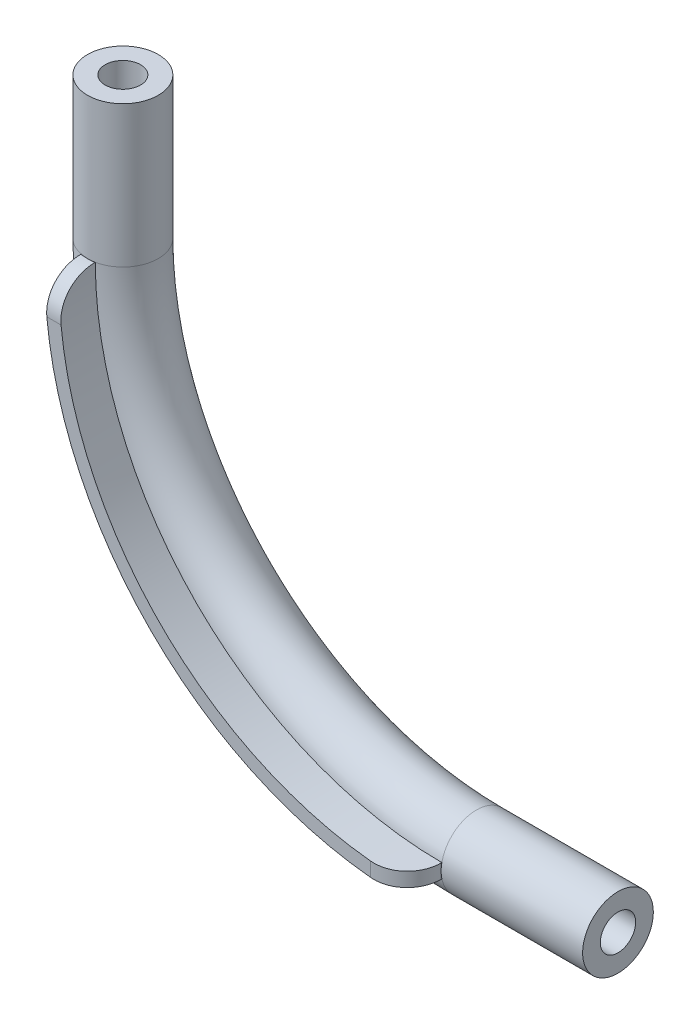
ISO-10303-21;
HEADER;
FILE_DESCRIPTION(('STEP AP214'),'2;1');
FILE_NAME('part.step','',(''),(''),'','','');
FILE_SCHEMA(('AUTOMOTIVE_DESIGN { 1 0 10303 214 1 1 1 1 }'));
ENDSEC;
DATA;
#1=APPLICATION_CONTEXT('core data for automotive mechanical design processes');
#2=APPLICATION_PROTOCOL_DEFINITION('international standard','automotive_design',2000,#1);
#3=PRODUCT_CONTEXT('',#1,'mechanical');
#4=PRODUCT('Part','Part','',(#3));
#5=PRODUCT_RELATED_PRODUCT_CATEGORY('part','',(#4));
#6=PRODUCT_DEFINITION_FORMATION('','',#4);
#7=PRODUCT_DEFINITION_CONTEXT('part definition',#1,'design');
#8=PRODUCT_DEFINITION('design','',#6,#7);
#9=PRODUCT_DEFINITION_SHAPE('','',#8);
#10=(LENGTH_UNIT() NAMED_UNIT(*) SI_UNIT(.MILLI.,.METRE.));
#11=(NAMED_UNIT(*) PLANE_ANGLE_UNIT() SI_UNIT($,.RADIAN.));
#12=(NAMED_UNIT(*) SI_UNIT($,.STERADIAN.) SOLID_ANGLE_UNIT());
#13=UNCERTAINTY_MEASURE_WITH_UNIT(LENGTH_MEASURE(1.E-05),#10,'distance_accuracy_value','');
#14=(GEOMETRIC_REPRESENTATION_CONTEXT(3) GLOBAL_UNCERTAINTY_ASSIGNED_CONTEXT((#13)) GLOBAL_UNIT_ASSIGNED_CONTEXT((#10,
#11,#12)) REPRESENTATION_CONTEXT('',''));
#15=CARTESIAN_POINT('',(0.,0.,0.));
#16=DIRECTION('',(0.,0.,1.));
#17=DIRECTION('',(1.,0.,0.));
#18=AXIS2_PLACEMENT_3D('',#15,#16,#17);
#19=CARTESIAN_POINT('',(-48.9999999999999,0.,10.));
#20=DIRECTION('',(0.,-1.,0.));
#21=DIRECTION('',(0.,0.,-1.));
#22=AXIS2_PLACEMENT_3D('',#19,#20,#21);
#23=PLANE('',#22);
#24=DIRECTION('',(0.,0.,-1.));
#25=VECTOR('',#24,1.);
#26=CARTESIAN_POINT('',(-50.9999999999999,0.,10.));
#27=LINE('',#26,#25);
#28=CARTESIAN_POINT('',(-50.9999999999999,0.,5.));
#29=VERTEX_POINT('',#28);
#30=CARTESIAN_POINT('',(-50.9999999999999,0.,4.89897948556637));
#31=VERTEX_POINT('',#30);
#32=EDGE_CURVE('E103',#29,#31,#27,.T.);
#33=ORIENTED_EDGE('',*,*,#32,.F.);
#34=DIRECTION('',(-1.,0.,0.));
#35=VECTOR('',#34,1.);
#36=CARTESIAN_POINT('',(-48.9999999999999,0.,5.));
#37=LINE('',#36,#35);
#38=CARTESIAN_POINT('',(-50.,0.,5.));
#39=VERTEX_POINT('',#38);
#40=EDGE_CURVE('E12',#29,#39,#37,.F.);
#41=ORIENTED_EDGE('',*,*,#40,.T.);
#42=CARTESIAN_POINT('',(-50.,0.,0.));
#43=DIRECTION('',(0.,1.,0.));
#44=DIRECTION('',(0.,0.,1.));
#45=AXIS2_PLACEMENT_3D('',#42,#43,#44);
#46=CIRCLE('',#45,5.);
#47=EDGE_CURVE('E114',#31,#39,#46,.T.);
#48=ORIENTED_EDGE('',*,*,#47,.F.);
#49=EDGE_LOOP('',(#33,#41,#48));
#50=FACE_BOUND('',#49,.T.);
#51=ADVANCED_FACE('F45',(#50),#23,.F.);
#52=CARTESIAN_POINT('',(0.,-48.9999999999999,10.));
#53=DIRECTION('',(-1.,0.,0.));
#54=DIRECTION('',(0.,0.,1.));
#55=AXIS2_PLACEMENT_3D('',#52,#53,#54);
#56=PLANE('',#55);
#57=DIRECTION('',(0.,0.,-1.));
#58=VECTOR('',#57,1.);
#59=CARTESIAN_POINT('',(0.,-48.9999999999999,10.));
#60=LINE('',#59,#58);
#61=CARTESIAN_POINT('',(0.,-48.9999999999999,5.));
#62=VERTEX_POINT('',#61);
#63=CARTESIAN_POINT('',(0.,-48.9999999999999,4.89897948556634));
#64=VERTEX_POINT('',#63);
#65=EDGE_CURVE('E168',#62,#64,#60,.T.);
#66=ORIENTED_EDGE('',*,*,#65,.F.);
#67=DIRECTION('',(0.,1.,0.));
#68=VECTOR('',#67,1.);
#69=CARTESIAN_POINT('',(0.,-50.9999999999999,5.));
#70=LINE('',#69,#68);
#71=CARTESIAN_POINT('',(1.74574066942157E-13,-50.,5.));
#72=VERTEX_POINT('',#71);
#73=EDGE_CURVE('E305',#62,#72,#70,.F.);
#74=ORIENTED_EDGE('',*,*,#73,.T.);
#75=CARTESIAN_POINT('',(1.74574066942157E-13,-50.,0.));
#76=DIRECTION('',(-1.,0.,0.));
#77=DIRECTION('',(0.,0.,1.));
#78=AXIS2_PLACEMENT_3D('',#75,#76,#77);
#79=CIRCLE('',#78,5.);
#80=EDGE_CURVE('E136',#72,#64,#79,.T.);
#81=ORIENTED_EDGE('',*,*,#80,.T.);
#82=EDGE_LOOP('',(#66,#74,#81));
#83=FACE_BOUND('',#82,.T.);
#84=ADVANCED_FACE('F251',(#83),#56,.F.);
#85=CARTESIAN_POINT('',(0.,0.,0.));
#86=DIRECTION('',(0.,0.,-1.));
#87=DIRECTION('',(-1.,0.,0.));
#88=AXIS2_PLACEMENT_3D('',#85,#86,#87);
#89=TOROIDAL_SURFACE('',#88,50.,5.);
#90=CARTESIAN_POINT('',(-48.9999999999999,0.,4.89897948556634));
#91=VERTEX_POINT('',#90);
#92=EDGE_CURVE('E119',#91,#31,#46,.T.);
#93=ORIENTED_EDGE('',*,*,#92,.F.);
#94=CARTESIAN_POINT('',(0.,0.,4.89897948556634));
#95=DIRECTION('',(0.,0.,-1.));
#96=DIRECTION('',(-1.,0.,0.));
#97=AXIS2_PLACEMENT_3D('',#94,#95,#96);
#98=CIRCLE('',#97,48.9999999999999);
#99=EDGE_CURVE('E130',#91,#64,#98,.F.);
#100=ORIENTED_EDGE('',*,*,#99,.T.);
#101=CARTESIAN_POINT('',(0.,-50.9999999999999,4.89897948556637));
#102=VERTEX_POINT('',#101);
#103=EDGE_CURVE('E128',#64,#102,#79,.T.);
#104=ORIENTED_EDGE('',*,*,#103,.T.);
#105=CARTESIAN_POINT('',(0.,0.,4.89897948556637));
#106=DIRECTION('',(0.,0.,-1.));
#107=DIRECTION('',(-1.,0.,0.));
#108=AXIS2_PLACEMENT_3D('',#105,#106,#107);
#109=CIRCLE('',#108,50.9999999999999);
#110=EDGE_CURVE('E107',#102,#31,#109,.T.);
#111=ORIENTED_EDGE('',*,*,#110,.T.);
#112=EDGE_LOOP('',(#93,#100,#104,#111));
#113=FACE_BOUND('',#112,.T.);
#114=ADVANCED_FACE('F125',(#113),#89,.T.);
#115=CARTESIAN_POINT('',(20.0000000000002,-49.9999999999999,0.));
#116=DIRECTION('',(1.,0.,0.));
#117=DIRECTION('',(0.,1.,0.));
#118=AXIS2_PLACEMENT_3D('',#115,#116,#117);
#119=PLANE('',#118);
#120=CARTESIAN_POINT('',(20.0000000000002,-49.9999999999999,0.));
#121=DIRECTION('',(1.,0.,0.));
#122=DIRECTION('',(0.,1.,0.));
#123=AXIS2_PLACEMENT_3D('',#120,#121,#122);
#124=CIRCLE('',#123,5.);
#125=CARTESIAN_POINT('',(20.0000000000002,-44.9999999999999,0.));
#126=VERTEX_POINT('',#125);
#127=EDGE_CURVE('E142',#126,#126,#124,.T.);
#128=ORIENTED_EDGE('',*,*,#127,.T.);
#129=EDGE_LOOP('',(#128));
#130=FACE_BOUND('',#129,.T.);
#131=CARTESIAN_POINT('',(20.0000000000002,-49.9999999999999,0.));
#132=DIRECTION('',(1.,0.,0.));
#133=DIRECTION('',(0.,1.,0.));
#134=AXIS2_PLACEMENT_3D('',#131,#132,#133);
#135=CIRCLE('',#134,2.5);
#136=CARTESIAN_POINT('',(20.0000000000002,-47.4999999999999,0.));
#137=VERTEX_POINT('',#136);
#138=EDGE_CURVE('E145',#137,#137,#135,.T.);
#139=ORIENTED_EDGE('',*,*,#138,.F.);
#140=EDGE_LOOP('',(#139));
#141=FACE_BOUND('',#140,.T.);
#142=ADVANCED_FACE('F238',(#130,#141),#119,.T.);
#143=CARTESIAN_POINT('',(20.0000000000002,-49.9999999999999,0.));
#144=DIRECTION('',(-1.,0.,0.));
#145=DIRECTION('',(0.,-1.,0.));
#146=AXIS2_PLACEMENT_3D('',#143,#144,#145);
#147=CYLINDRICAL_SURFACE('',#146,5.);
#148=ORIENTED_EDGE('',*,*,#127,.F.);
#149=EDGE_LOOP('',(#148));
#150=FACE_BOUND('',#149,.T.);
#151=ORIENTED_EDGE('',*,*,#103,.F.);
#152=ORIENTED_EDGE('',*,*,#80,.F.);
#153=EDGE_CURVE('E138',#102,#72,#79,.T.);
#154=ORIENTED_EDGE('',*,*,#153,.F.);
#155=EDGE_LOOP('',(#151,#152,#154));
#156=FACE_BOUND('',#155,.T.);
#157=ADVANCED_FACE('F236',(#150,#156),#147,.T.);
#158=CARTESIAN_POINT('',(20.0000000000002,-49.9999999999999,0.));
#159=DIRECTION('',(-1.,0.,0.));
#160=DIRECTION('',(0.,-1.,0.));
#161=AXIS2_PLACEMENT_3D('',#158,#159,#160);
#162=CYLINDRICAL_SURFACE('',#161,2.5);
#163=ORIENTED_EDGE('',*,*,#138,.T.);
#164=EDGE_LOOP('',(#163));
#165=FACE_BOUND('',#164,.T.);
#166=CARTESIAN_POINT('',(1.74574066942157E-13,-50.,0.));
#167=DIRECTION('',(1.,0.,0.));
#168=DIRECTION('',(0.,1.,0.));
#169=AXIS2_PLACEMENT_3D('',#166,#167,#168);
#170=CIRCLE('',#169,2.5);
#171=CARTESIAN_POINT('',(1.65845363595049E-13,-47.5,0.));
#172=VERTEX_POINT('',#171);
#173=EDGE_CURVE('E150',#172,#172,#170,.T.);
#174=ORIENTED_EDGE('',*,*,#173,.F.);
#175=EDGE_LOOP('',(#174));
#176=FACE_BOUND('',#175,.T.);
#177=ADVANCED_FACE('F233',(#165,#176),#162,.F.);
#178=CARTESIAN_POINT('',(1.74574066942157E-13,-50.,0.));
#179=DIRECTION('',(-1.,0.,0.));
#180=DIRECTION('',(0.,0.,1.));
#181=AXIS2_PLACEMENT_3D('',#178,#179,#180);
#182=PLANE('',#181);
#183=ORIENTED_EDGE('',*,*,#173,.T.);
#184=EDGE_LOOP('',(#183));
#185=FACE_BOUND('',#184,.T.);
#186=ADVANCED_FACE('F228',(#185),#182,.F.);
#187=CARTESIAN_POINT('',(-50.,20.,0.));
#188=DIRECTION('',(0.,1.,0.));
#189=DIRECTION('',(0.,0.,1.));
#190=AXIS2_PLACEMENT_3D('',#187,#188,#189);
#191=PLANE('',#190);
#192=CARTESIAN_POINT('',(-50.,20.,0.));
#193=DIRECTION('',(0.,1.,0.));
#194=DIRECTION('',(0.,0.,1.));
#195=AXIS2_PLACEMENT_3D('',#192,#193,#194);
#196=CIRCLE('',#195,5.);
#197=CARTESIAN_POINT('',(-50.,20.,5.));
#198=VERTEX_POINT('',#197);
#199=EDGE_CURVE('E155',#198,#198,#196,.T.);
#200=ORIENTED_EDGE('',*,*,#199,.T.);
#201=EDGE_LOOP('',(#200));
#202=FACE_BOUND('',#201,.T.);
#203=CARTESIAN_POINT('',(-50.,20.,0.));
#204=DIRECTION('',(0.,1.,0.));
#205=DIRECTION('',(0.,0.,1.));
#206=AXIS2_PLACEMENT_3D('',#203,#204,#205);
#207=CIRCLE('',#206,2.5);
#208=CARTESIAN_POINT('',(-50.,20.,2.5));
#209=VERTEX_POINT('',#208);
#210=EDGE_CURVE('E160',#209,#209,#207,.T.);
#211=ORIENTED_EDGE('',*,*,#210,.F.);
#212=EDGE_LOOP('',(#211));
#213=FACE_BOUND('',#212,.T.);
#214=ADVANCED_FACE('F225',(#202,#213),#191,.T.);
#215=CARTESIAN_POINT('',(-50.,20.,0.));
#216=DIRECTION('',(0.,-1.,0.));
#217=DIRECTION('',(0.,0.,-1.));
#218=AXIS2_PLACEMENT_3D('',#215,#216,#217);
#219=CYLINDRICAL_SURFACE('',#218,5.);
#220=ORIENTED_EDGE('',*,*,#199,.F.);
#221=EDGE_LOOP('',(#220));
#222=FACE_BOUND('',#221,.T.);
#223=ORIENTED_EDGE('',*,*,#92,.T.);
#224=ORIENTED_EDGE('',*,*,#47,.T.);
#225=EDGE_CURVE('E120',#39,#91,#46,.T.);
#226=ORIENTED_EDGE('',*,*,#225,.T.);
#227=EDGE_LOOP('',(#223,#224,#226));
#228=FACE_BOUND('',#227,.T.);
#229=ADVANCED_FACE('F133',(#222,#228),#219,.T.);
#230=CARTESIAN_POINT('',(-50.,20.,0.));
#231=DIRECTION('',(0.,-1.,0.));
#232=DIRECTION('',(0.,0.,-1.));
#233=AXIS2_PLACEMENT_3D('',#230,#231,#232);
#234=CYLINDRICAL_SURFACE('',#233,2.5);
#235=ORIENTED_EDGE('',*,*,#210,.T.);
#236=EDGE_LOOP('',(#235));
#237=FACE_BOUND('',#236,.T.);
#238=CARTESIAN_POINT('',(-50.,0.,0.));
#239=DIRECTION('',(0.,1.,0.));
#240=DIRECTION('',(0.,0.,1.));
#241=AXIS2_PLACEMENT_3D('',#238,#239,#240);
#242=CIRCLE('',#241,2.5);
#243=CARTESIAN_POINT('',(-50.,0.,2.5));
#244=VERTEX_POINT('',#243);
#245=EDGE_CURVE('E131',#244,#244,#242,.F.);
#246=ORIENTED_EDGE('',*,*,#245,.T.);
#247=EDGE_LOOP('',(#246));
#248=FACE_BOUND('',#247,.T.);
#249=ADVANCED_FACE('F220',(#237,#248),#234,.F.);
#250=CARTESIAN_POINT('',(-50.,0.,0.));
#251=DIRECTION('',(0.,1.,0.));
#252=DIRECTION('',(0.,0.,1.));
#253=AXIS2_PLACEMENT_3D('',#250,#251,#252);
#254=PLANE('',#253);
#255=ORIENTED_EDGE('',*,*,#245,.F.);
#256=EDGE_LOOP('',(#255));
#257=FACE_BOUND('',#256,.T.);
#258=ADVANCED_FACE('F218',(#257),#254,.T.);
#259=CARTESIAN_POINT('',(0.,0.,10.));
#260=DIRECTION('',(0.,0.,-1.));
#261=DIRECTION('',(-1.,0.,0.));
#262=AXIS2_PLACEMENT_3D('',#259,#260,#261);
#263=CYLINDRICAL_SURFACE('',#262,48.9999999999999);
#264=CARTESIAN_POINT('',(0.,0.,10.));
#265=DIRECTION('',(0.,0.,-1.));
#266=DIRECTION('',(1.,0.,0.));
#267=AXIS2_PLACEMENT_3D('',#264,#265,#266);
#268=CIRCLE('',#267,48.9999999999999);
#269=CARTESIAN_POINT('',(-5.,-48.7442304278157,10.));
#270=VERTEX_POINT('',#269);
#271=CARTESIAN_POINT('',(-48.7442304278157,-5.,10.));
#272=VERTEX_POINT('',#271);
#273=EDGE_CURVE('E176',#270,#272,#268,.T.);
#274=ORIENTED_EDGE('',*,*,#273,.F.);
#275=CARTESIAN_POINT('',(-5.,-48.7442304278157,10.));
#276=CARTESIAN_POINT('',(-4.86017441797673,-48.7585792797511,10.0000153004217));
#277=CARTESIAN_POINT('',(-4.7202855809839,-48.7723147059681,9.99413521876398));
#278=CARTESIAN_POINT('',(-4.44137503190063,-48.7985004736699,9.97066217371852));
#279=CARTESIAN_POINT('',(-4.30235330762638,-48.8109508332494,9.95306937528225));
#280=CARTESIAN_POINT('',(-4.02626060146251,-48.8345006258867,9.90626470659038));
#281=CARTESIAN_POINT('',(-3.8891883564166,-48.8456009725255,9.87706075161901));
#282=CARTESIAN_POINT('',(-3.61788542500017,-48.8664445655823,9.80722130069914));
#283=CARTESIAN_POINT('',(-3.48365467328208,-48.8761878432384,9.76658606795056));
#284=CARTESIAN_POINT('',(-3.2189370920303,-48.8943356474136,9.67412889114649));
#285=CARTESIAN_POINT('',(-3.08845207550527,-48.9027395343098,9.6223016300176));
#286=CARTESIAN_POINT('',(-2.83219052461939,-48.9182499884162,9.50780478812476));
#287=CARTESIAN_POINT('',(-2.70641575196349,-48.9253560740058,9.44513119896824));
#288=CARTESIAN_POINT('',(-2.46061218599521,-48.9383339355701,9.3094322427144));
#289=CARTESIAN_POINT('',(-2.34057999933082,-48.9442064476103,9.23641309255532));
#290=CARTESIAN_POINT('',(-2.10700734464295,-48.9548178928924,9.08048017956363));
#291=CARTESIAN_POINT('',(-1.99346928425211,-48.9595564077627,8.99756278177549));
#292=CARTESIAN_POINT('',(-1.77409549093508,-48.9679956690767,8.82271543306467));
#293=CARTESIAN_POINT('',(-1.66823694192971,-48.9716995913831,8.73081425868718));
#294=CARTESIAN_POINT('',(-1.46455588320102,-48.9782141866266,8.53839929025428));
#295=CARTESIAN_POINT('',(-1.36673637358137,-48.9810245271987,8.43788230918329));
#296=CARTESIAN_POINT('',(-1.17989079118149,-48.9858815691733,8.2289935243221));
#297=CARTESIAN_POINT('',(-1.09086340561423,-48.9879283847078,8.12062289739341));
#298=CARTESIAN_POINT('',(-0.922189672051435,-48.991394011965,7.89674187985369));
#299=CARTESIAN_POINT('',(-0.842546681176386,-48.9928125994464,7.78122895659379));
#300=CARTESIAN_POINT('',(-0.693156182563999,-48.9951540940655,7.54377564579952));
#301=CARTESIAN_POINT('',(-0.623420528165078,-48.9960764110701,7.4218277945569));
#302=CARTESIAN_POINT('',(-0.494452808233343,-48.9975476631925,7.17249761095789));
#303=CARTESIAN_POINT('',(-0.435220804632002,-48.9980965961088,7.04511524656409));
#304=CARTESIAN_POINT('',(-0.327705674289029,-48.9989336812648,6.78587323878777));
#305=CARTESIAN_POINT('',(-0.279417512301815,-48.9992219536172,6.65401568667158));
#306=CARTESIAN_POINT('',(-0.194108484119477,-48.9996340250887,6.38675609929582));
#307=CARTESIAN_POINT('',(-0.157085261454811,-48.9997578586243,6.25135481178156));
#308=CARTESIAN_POINT('',(-0.0840325125515623,-48.9999461926989,5.93185869757287));
#309=CARTESIAN_POINT('',(-0.0525228803330134,-48.9999767426749,5.74669930777758));
#310=CARTESIAN_POINT('',(-0.021013636381859,-48.9999964252199,5.46741856342599));
#311=CARTESIAN_POINT('',(-0.0131364293502629,-48.9999986341404,5.37411267438593));
#312=CARTESIAN_POINT('',(-0.00263029648664553,-49.000000097563,5.18721247932757));
#313=CARTESIAN_POINT('',(-9.9877976467384E-07,-48.9999993522744,5.09361819421621));
#314=CARTESIAN_POINT('',(0.,-48.9999999999999,5.));
#315=B_SPLINE_CURVE_WITH_KNOTS('',3,(#275,#276,#277,#278,#279,#280,#281,#282,#283,#284,#285,
#286,#287,#288,#289,#290,#291,#292,#293,#294,#295,#296,#297,#298,#299,#300,#301,#302,#303,#304,
#305,#306,#307,#308,#309,#310,#311,#312,#313,#314),.UNSPECIFIED.,.F.,.F.,(4,2,2,2,2,2,2,2,2,2,2,
2,2,2,2,2,2,2,2,4),(0.,0.421555963410781,0.843105990128122,1.26436913905422,1.68562258938376,
2.10707660947677,2.52868671694139,2.95004453324109,3.37155756449861,3.79176210045412,
4.21212274784636,4.63242053431788,5.05286822218543,5.47381478072738,5.89476382116584,
6.31551878858702,6.73618567927903,7.29829803666771,7.57908788996456,7.8598578453576),.UNSPECIFIED.);
#316=EDGE_CURVE('E206',#270,#62,#315,.T.);
#317=ORIENTED_EDGE('',*,*,#316,.T.);
#318=ORIENTED_EDGE('',*,*,#65,.T.);
#319=ORIENTED_EDGE('',*,*,#99,.F.);
#320=DIRECTION('',(0.,0.,-1.));
#321=VECTOR('',#320,1.);
#322=CARTESIAN_POINT('',(-48.9999999999999,0.,10.));
#323=LINE('',#322,#321);
#324=CARTESIAN_POINT('',(-48.9999999999999,0.,5.));
#325=VERTEX_POINT('',#324);
#326=EDGE_CURVE('E110',#325,#91,#323,.T.);
#327=ORIENTED_EDGE('',*,*,#326,.F.);
#328=CARTESIAN_POINT('',(-48.9999999999999,0.,5.));
#329=CARTESIAN_POINT('',(-48.9999954407541,1.5116103047684E-05,5.14061579751975));
#330=CARTESIAN_POINT('',(-48.9999998568247,-0.00593120632708683,5.28122942656025));
#331=CARTESIAN_POINT('',(-48.9999936885569,-0.0296375564188861,5.56145089357603));
#332=CARTESIAN_POINT('',(-48.9999831049315,-0.047397022587143,5.70105877903677));
#333=CARTESIAN_POINT('',(-48.9999140175444,-0.0946030951902842,5.97817864218076));
#334=CARTESIAN_POINT('',(-48.9998555491269,-0.124041073341283,6.11569208955887));
#335=CARTESIAN_POINT('',(-48.9996271109046,-0.194390037526974,6.38775030943293));
#336=CARTESIAN_POINT('',(-48.9994571424616,-0.235300883418774,6.52229511816962));
#337=CARTESIAN_POINT('',(-48.9989220825565,-0.328320680339807,6.78750276242415));
#338=CARTESIAN_POINT('',(-48.9985569308894,-0.380433083563825,6.91816438702561));
#339=CARTESIAN_POINT('',(-48.9975284164436,-0.495498762833758,7.1746806297005));
#340=CARTESIAN_POINT('',(-48.9968649434545,-0.55845604005309,7.30053345257194));
#341=CARTESIAN_POINT('',(-48.9951223242593,-0.694712475539834,7.54641806246559));
#342=CARTESIAN_POINT('',(-48.9940434036472,-0.768006007408455,7.6664529689405));
#343=CARTESIAN_POINT('',(-48.991340894769,-0.924466707960854,7.89996333041406));
#344=CARTESIAN_POINT('',(-48.989717106207,-1.00763750029442,8.01343635522673));
#345=CARTESIAN_POINT('',(-48.985791988462,-1.18316546894873,8.23287789779556));
#346=CARTESIAN_POINT('',(-48.9834912036673,-1.27551522489275,8.33885236070941));
#347=CARTESIAN_POINT('',(-48.9780756282623,-1.46882874663131,8.54267767255931));
#348=CARTESIAN_POINT('',(-48.9749605545581,-1.56979549995608,8.64052568064785));
#349=CARTESIAN_POINT('',(-48.9677861768674,-1.77958693723285,8.82735795752164));
#350=CARTESIAN_POINT('',(-48.9637268914235,-1.88841146684463,8.91634240032088));
#351=CARTESIAN_POINT('',(-48.9545432522218,-2.11313474407735,9.08481702443097));
#352=CARTESIAN_POINT('',(-48.9494188997168,-2.22903348337634,9.16430721691031));
#353=CARTESIAN_POINT('',(-48.9380077002627,-2.46689173686443,9.31312109448847));
#354=CARTESIAN_POINT('',(-48.9317225763184,-2.58884207460704,9.38245957843406));
#355=CARTESIAN_POINT('',(-48.9179018918586,-2.83803469194407,9.51060198060753));
#356=CARTESIAN_POINT('',(-48.9103667619265,-2.96527513800997,9.56940951192511));
#357=CARTESIAN_POINT('',(-48.8939842478052,-3.22414517502768,9.6761019640867));
#358=CARTESIAN_POINT('',(-48.8851371660683,-3.35577374894973,9.72398939596869));
#359=CARTESIAN_POINT('',(-48.8661006638445,-3.62244254978064,9.80852460914133));
#360=CARTESIAN_POINT('',(-48.8559115537624,-3.75748198195404,9.84517498300761));
#361=CARTESIAN_POINT('',(-48.8305648918018,-4.07541929714135,9.91729494497442));
#362=CARTESIAN_POINT('',(-48.8148813186654,-4.25931190518359,9.94832684711164));
#363=CARTESIAN_POINT('',(-48.7896392574491,-4.53648923191161,9.97933817813638));
#364=CARTESIAN_POINT('',(-48.7809440500714,-4.62905662196057,9.98708587047436));
#365=CARTESIAN_POINT('',(-48.7629988551811,-4.81441744727475,9.99741606451208));
#366=CARTESIAN_POINT('',(-48.7537489163378,-4.90721086202644,9.99999901865776));
#367=CARTESIAN_POINT('',(-48.7442304278157,-5.,10.));
#368=B_SPLINE_CURVE_WITH_KNOTS('',3,(#328,#329,#330,#331,#332,#333,#334,#335,#336,#337,#338,
#339,#340,#341,#342,#343,#344,#345,#346,#347,#348,#349,#350,#351,#352,#353,#354,#355,#356,#357,
#358,#359,#360,#361,#362,#363,#364,#365,#366,#367),.UNSPECIFIED.,.F.,.F.,(4,2,2,2,2,2,2,2,2,2,2,
2,2,2,2,2,2,2,2,4),(0.,0.42171866283896,0.843417282297798,1.26480492212145,1.68618741485275,
2.10769995963427,2.52936835420132,2.9508080989945,3.37240293692465,3.79365968289318,
4.2150630773888,4.63645819704817,5.05785282099674,5.47862689809681,5.89925633306248,
6.31978894803545,6.7402244660232,7.30034199267689,7.58011211030935,7.85985771819981),.UNSPECIFIED.);
#369=EDGE_CURVE('E191',#325,#272,#368,.T.);
#370=ORIENTED_EDGE('',*,*,#369,.T.);
#371=EDGE_LOOP('',(#274,#317,#318,#319,#327,#370));
#372=FACE_BOUND('',#371,.T.);
#373=ADVANCED_FACE('F212',(#372),#263,.F.);
#374=ORIENTED_EDGE('',*,*,#225,.F.);
#375=DIRECTION('',(-1.,0.,0.));
#376=VECTOR('',#375,1.);
#377=CARTESIAN_POINT('',(-48.9999999999999,0.,5.));
#378=LINE('',#377,#376);
#379=EDGE_CURVE('E55',#39,#325,#378,.F.);
#380=ORIENTED_EDGE('',*,*,#379,.T.);
#381=ORIENTED_EDGE('',*,*,#326,.T.);
#382=EDGE_LOOP('',(#374,#380,#381));
#383=FACE_BOUND('',#382,.T.);
#384=ADVANCED_FACE('F217',(#383),#23,.F.);
#385=CARTESIAN_POINT('',(0.,0.,10.));
#386=DIRECTION('',(0.,0.,-1.));
#387=DIRECTION('',(-1.,0.,0.));
#388=AXIS2_PLACEMENT_3D('',#385,#386,#387);
#389=CYLINDRICAL_SURFACE('',#388,50.9999999999999);
#390=DIRECTION('',(0.,0.,-1.));
#391=VECTOR('',#390,1.);
#392=CARTESIAN_POINT('',(0.,-50.9999999999999,10.));
#393=LINE('',#392,#391);
#394=CARTESIAN_POINT('',(0.,-50.9999999999999,5.));
#395=VERTEX_POINT('',#394);
#396=EDGE_CURVE('E111',#395,#102,#393,.T.);
#397=ORIENTED_EDGE('',*,*,#396,.F.);
#398=CARTESIAN_POINT('',(0.,-50.9999999999999,5.));
#399=CARTESIAN_POINT('',(1.51165821244125E-05,-50.9999956194109,5.14061691103455));
#400=CARTESIAN_POINT('',(-0.00593130024615167,-50.9999998624354,5.28123165343222));
#401=CARTESIAN_POINT('',(-0.0296380250570284,-50.9999939358723,5.56145531874239));
#402=CARTESIAN_POINT('',(-0.0473977711387302,-50.9999837669701,5.70106428917519));
#403=CARTESIAN_POINT('',(-0.0946045528068215,-50.9999173868516,5.97818608335192));
#404=CARTESIAN_POINT('',(-0.124042943829969,-50.999861209658,6.1157003795753));
#405=CARTESIAN_POINT('',(-0.194392879109099,-50.9996417236056,6.38776024234867));
#406=CARTESIAN_POINT('',(-0.235304283227387,-50.9994784160554,6.52230584513826));
#407=CARTESIAN_POINT('',(-0.328325321337979,-50.9989643253241,6.78751496005708));
#408=CARTESIAN_POINT('',(-0.380438402295346,-50.998613484386,6.91817726310317));
#409=CARTESIAN_POINT('',(-0.495505593804555,-50.9976252801734,7.17469483851656));
#410=CARTESIAN_POINT('',(-0.558463705503597,-50.9969878110105,7.30054831571101));
#411=CARTESIAN_POINT('',(-0.694722017572249,-50.9953134942731,7.54643425190135));
#412=CARTESIAN_POINT('',(-0.768016589112211,-50.9942768635381,7.66646983160594));
#413=CARTESIAN_POINT('',(-0.924479737445802,-50.9916802883422,7.89998170580588));
#414=CARTESIAN_POINT('',(-1.0076519382617,-50.9901201514254,8.01345557001591));
#415=CARTESIAN_POINT('',(-1.18318630067075,-50.9863488393171,8.23290277714402));
#416=CARTESIAN_POINT('',(-1.2755413499303,-50.9841381654209,8.33888181776823));
#417=CARTESIAN_POINT('',(-1.46886710755646,-50.9789346708717,8.54271620671361));
#418=CARTESIAN_POINT('',(-1.56984080393047,-50.9759415782133,8.64056871425179));
#419=CARTESIAN_POINT('',(-1.77964870579722,-50.9690480977443,8.82741027733527));
#420=CARTESIAN_POINT('',(-1.88848278180411,-50.9651477248772,8.91639947883045));
#421=CARTESIAN_POINT('',(-2.1132282683217,-50.9563235590153,9.08488352290228));
#422=CARTESIAN_POINT('',(-2.2291396715035,-50.9513997670804,9.16437837531053));
#423=CARTESIAN_POINT('',(-2.46704416421816,-50.9404343385782,9.31321173814765));
#424=CARTESIAN_POINT('',(-2.5890289502651,-50.9343941991897,9.38256363115571));
#425=CARTESIAN_POINT('',(-2.83829710614405,-50.9211119449557,9.51072895409191));
#426=CARTESIAN_POINT('',(-2.96557864038697,-50.9138702439551,9.56954599800604));
#427=CARTESIAN_POINT('',(-3.22453761052937,-50.898125419843,9.67625228133364));
#428=CARTESIAN_POINT('',(-3.35621400515131,-50.8896225939094,9.72414408849673));
#429=CARTESIAN_POINT('',(-3.62298645230016,-50.8713265023267,9.80868183662249));
#430=CARTESIAN_POINT('',(-3.75808170600012,-50.8615335359143,9.84533037882128));
#431=CARTESIAN_POINT('',(-4.07595893060625,-50.837187267497,9.91739152222917));
#432=CARTESIAN_POINT('',(-4.25973380132447,-50.8221308187918,9.94838574422189));
#433=CARTESIAN_POINT('',(-4.5367444503373,-50.7978992408308,9.97936086684539));
#434=CARTESIAN_POINT('',(-4.62925805440996,-50.7895522870717,9.98709987428325));
#435=CARTESIAN_POINT('',(-4.8145151730794,-50.7723261281449,9.99741873098123));
#436=CARTESIAN_POINT('',(-4.90725866717666,-50.7634469689058,9.9999990247733));
#437=CARTESIAN_POINT('',(-5.,-50.754310161798,10.));
#438=B_SPLINE_CURVE_WITH_KNOTS('',3,(#398,#399,#400,#401,#402,#403,#404,#405,#406,#407,#408,
#409,#410,#411,#412,#413,#414,#415,#416,#417,#418,#419,#420,#421,#422,#423,#424,#425,#426,#427,
#428,#429,#430,#431,#432,#433,#434,#435,#436,#437),.UNSPECIFIED.,.F.,.F.,(4,2,2,2,2,2,2,2,2,2,2,
2,2,2,2,2,2,2,2,4),(0.,0.421722000156938,0.843423942545009,1.2648143207364,1.68619955205798,
2.10771463758813,2.52938557056202,2.95082775849418,3.37242505063513,3.79369831232285,
4.21511822354136,4.63653119419484,5.05794372846278,5.47879513729429,5.89950189513351,
6.3201096724947,6.7406200647379,7.3002209342195,7.57973354835857,7.85922207555419),.UNSPECIFIED.);
#439=CARTESIAN_POINT('',(-5.,-50.754310161798,10.));
#440=VERTEX_POINT('',#439);
#441=EDGE_CURVE('E258',#395,#440,#438,.T.);
#442=ORIENTED_EDGE('',*,*,#441,.T.);
#443=CARTESIAN_POINT('',(0.,0.,10.));
#444=DIRECTION('',(0.,0.,1.));
#445=DIRECTION('',(1.,0.,0.));
#446=AXIS2_PLACEMENT_3D('',#443,#444,#445);
#447=CIRCLE('',#446,50.9999999999999);
#448=CARTESIAN_POINT('',(-50.754310161798,-5.,10.));
#449=VERTEX_POINT('',#448);
#450=EDGE_CURVE('E172',#449,#440,#447,.T.);
#451=ORIENTED_EDGE('',*,*,#450,.F.);
#452=CARTESIAN_POINT('',(-50.754310161798,-5.,10.));
#453=CARTESIAN_POINT('',(-50.7680968498896,-4.86011244824328,10.0000152874444));
#454=CARTESIAN_POINT('',(-50.7812938572234,-4.72016666358805,9.99413002304608));
#455=CARTESIAN_POINT('',(-50.8064525690978,-4.44115289349825,9.97063867051091));
#456=CARTESIAN_POINT('',(-50.8184142942279,-4.30208489346905,9.95303277776996));
#457=CARTESIAN_POINT('',(-50.8410391971073,-4.02591103262136,9.90619652164649));
#458=CARTESIAN_POINT('',(-50.8517032604486,-3.88880389064309,9.87697414473158));
#459=CARTESIAN_POINT('',(-50.8717271162767,-3.61744100227229,9.80709449742674));
#460=CARTESIAN_POINT('',(-50.8810869377091,-3.48318519265501,9.7664374808711));
#461=CARTESIAN_POINT('',(-50.898519946384,-3.21842823455093,9.67393571203078));
#462=CARTESIAN_POINT('',(-50.9065925361274,-3.08792885259685,9.62208579042477));
#463=CARTESIAN_POINT('',(-50.921491169834,-2.83164619764094,9.50754356852958));
#464=CARTESIAN_POINT('',(-50.9283167510935,-2.70586468891213,9.44484726040941));
#465=CARTESIAN_POINT('',(-50.940782047108,-2.46005343318614,9.30910341369017));
#466=CARTESIAN_POINT('',(-50.9464224642109,-2.34002031235002,9.23606204895639));
#467=CARTESIAN_POINT('',(-50.9566142625356,-2.10645085836227,9.08008595026114));
#468=CARTESIAN_POINT('',(-50.9611652418289,-1.9929169346892,8.99714758183731));
#469=CARTESIAN_POINT('',(-50.9692711322565,-1.77353241078769,8.82224155043766));
#470=CARTESIAN_POINT('',(-50.9728288894206,-1.66766051485167,8.73030072781494));
#471=CARTESIAN_POINT('',(-50.9790860362402,-1.46395935281269,8.53780455213455));
#472=CARTESIAN_POINT('',(-50.9817851064434,-1.36613308989115,8.43724601069663));
#473=CARTESIAN_POINT('',(-50.9864495048595,-1.17928048473574,8.22827281585258));
#474=CARTESIAN_POINT('',(-50.988414943775,-1.09025281631267,8.11985935068102));
#475=CARTESIAN_POINT('',(-50.9917424873967,-0.921584731328881,7.89589169448093));
#476=CARTESIAN_POINT('',(-50.9931043767185,-0.841947673357111,7.78033497102481));
#477=CARTESIAN_POINT('',(-50.995351926683,-0.692581851305318,7.54280410791396));
#478=CARTESIAN_POINT('',(-50.9962370628158,-0.622864061888989,7.42082306165153));
#479=CARTESIAN_POINT('',(-50.9976488165549,-0.493936381366982,7.17142754508618));
#480=CARTESIAN_POINT('',(-50.9981754320921,-0.434726550906803,7.04401304342995));
#481=CARTESIAN_POINT('',(-50.9989783342078,-0.32726004378582,6.78470845755496));
#482=CARTESIAN_POINT('',(-50.9992547364679,-0.278998313207159,6.65282047086382));
#483=CARTESIAN_POINT('',(-50.9996497312667,-0.193746212290595,6.38550194763872));
#484=CARTESIAN_POINT('',(-50.9997683569323,-0.156753477165907,6.25007216083394));
#485=CARTESIAN_POINT('',(-50.9999485491559,-0.0838320461740131,5.93075565420996));
#486=CARTESIAN_POINT('',(-50.9999777613178,-0.0523974649147115,5.74581183987041));
#487=CARTESIAN_POINT('',(-50.9999965818255,-0.0209633995115506,5.46686053140972));
#488=CARTESIAN_POINT('',(-50.9999986939801,-0.0131050190052419,5.37366563199396));
#489=CARTESIAN_POINT('',(-51.000000093282,-0.00262399883677586,5.18698841099409));
#490=CARTESIAN_POINT('',(-50.999999380628,-9.91276655407168E-07,5.09350611006855));
#491=CARTESIAN_POINT('',(-50.9999999999999,0.,5.));
#492=B_SPLINE_CURVE_WITH_KNOTS('',3,(#452,#453,#454,#455,#456,#457,#458,#459,#460,#461,#462,
#463,#464,#465,#466,#467,#468,#469,#470,#471,#472,#473,#474,#475,#476,#477,#478,#479,#480,#481,
#482,#483,#484,#485,#486,#487,#488,#489,#490,#491),.UNSPECIFIED.,.F.,.F.,(4,2,2,2,2,2,2,2,2,2,2,
2,2,2,2,2,2,2,2,4),(0.,0.421571766853576,0.843136505814919,1.26441191400733,1.68567797116607,
2.1071390033023,2.52875610276811,2.95012263579236,3.37164438561061,3.79194558896987,
4.21240297215222,4.63279688392565,5.05334069810876,5.47434624213343,5.89535421586506,
6.31616744445241,6.73689230489948,7.2983344245204,7.5787881677868,7.85922220242976),.UNSPECIFIED.);
#493=EDGE_CURVE('E68',#449,#29,#492,.T.);
#494=ORIENTED_EDGE('',*,*,#493,.T.);
#495=ORIENTED_EDGE('',*,*,#32,.T.);
#496=ORIENTED_EDGE('',*,*,#110,.F.);
#497=EDGE_LOOP('',(#397,#442,#451,#494,#495,#496));
#498=FACE_BOUND('',#497,.T.);
#499=ADVANCED_FACE('F105',(#498),#389,.T.);
#500=ORIENTED_EDGE('',*,*,#153,.T.);
#501=DIRECTION('',(0.,1.,0.));
#502=VECTOR('',#501,1.);
#503=CARTESIAN_POINT('',(0.,-50.9999999999999,5.));
#504=LINE('',#503,#502);
#505=EDGE_CURVE('E302',#72,#395,#504,.F.);
#506=ORIENTED_EDGE('',*,*,#505,.T.);
#507=ORIENTED_EDGE('',*,*,#396,.T.);
#508=EDGE_LOOP('',(#500,#506,#507));
#509=FACE_BOUND('',#508,.T.);
#510=ADVANCED_FACE('F273',(#509),#56,.F.);
#511=CARTESIAN_POINT('',(0.,0.,10.));
#512=DIRECTION('',(0.,0.,1.));
#513=DIRECTION('',(1.,0.,0.));
#514=AXIS2_PLACEMENT_3D('',#511,#512,#513);
#515=PLANE('',#514);
#516=ORIENTED_EDGE('',*,*,#450,.T.);
#517=DIRECTION('',(0.,1.,0.));
#518=VECTOR('',#517,1.);
#519=CARTESIAN_POINT('',(-5.,-48.9999999999999,10.));
#520=LINE('',#519,#518);
#521=EDGE_CURVE('E187',#440,#270,#520,.T.);
#522=ORIENTED_EDGE('',*,*,#521,.T.);
#523=ORIENTED_EDGE('',*,*,#273,.T.);
#524=DIRECTION('',(-1.,0.,0.));
#525=VECTOR('',#524,1.);
#526=CARTESIAN_POINT('',(-50.9999999999999,-5.,10.));
#527=LINE('',#526,#525);
#528=EDGE_CURVE('E185',#272,#449,#527,.T.);
#529=ORIENTED_EDGE('',*,*,#528,.T.);
#530=EDGE_LOOP('',(#516,#522,#523,#529));
#531=FACE_BOUND('',#530,.T.);
#532=ADVANCED_FACE('F184',(#531),#515,.T.);
#533=CARTESIAN_POINT('',(-5.,0.,5.));
#534=DIRECTION('',(0.,-1.,0.));
#535=DIRECTION('',(0.,0.,-1.));
#536=AXIS2_PLACEMENT_3D('',#533,#534,#535);
#537=CYLINDRICAL_SURFACE('',#536,5.);
#538=ORIENTED_EDGE('',*,*,#505,.F.);
#539=ORIENTED_EDGE('',*,*,#73,.F.);
#540=ORIENTED_EDGE('',*,*,#316,.F.);
#541=ORIENTED_EDGE('',*,*,#521,.F.);
#542=ORIENTED_EDGE('',*,*,#441,.F.);
#543=EDGE_LOOP('',(#538,#539,#540,#541,#542));
#544=FACE_BOUND('',#543,.T.);
#545=ADVANCED_FACE('F252',(#544),#537,.T.);
#546=CARTESIAN_POINT('',(0.,-5.,5.));
#547=DIRECTION('',(1.,0.,0.));
#548=DIRECTION('',(0.,0.,-1.));
#549=AXIS2_PLACEMENT_3D('',#546,#547,#548);
#550=CYLINDRICAL_SURFACE('',#549,5.);
#551=ORIENTED_EDGE('',*,*,#379,.F.);
#552=ORIENTED_EDGE('',*,*,#40,.F.);
#553=ORIENTED_EDGE('',*,*,#493,.F.);
#554=ORIENTED_EDGE('',*,*,#528,.F.);
#555=ORIENTED_EDGE('',*,*,#369,.F.);
#556=EDGE_LOOP('',(#551,#552,#553,#554,#555));
#557=FACE_BOUND('',#556,.T.);
#558=ADVANCED_FACE('F47',(#557),#550,.T.);
#559=CLOSED_SHELL('',(#51,#84,#114,#142,#157,#177,#186,#214,#229,#249,#258,#373,#384,#499,#510,
#532,#545,#558));
#560=MANIFOLD_SOLID_BREP('B2',#559);
#561=ADVANCED_BREP_SHAPE_REPRESENTATION('',(#18,#560),#14);
#562=SHAPE_DEFINITION_REPRESENTATION(#9,#561);
ENDSEC;
END-ISO-10303-21;
